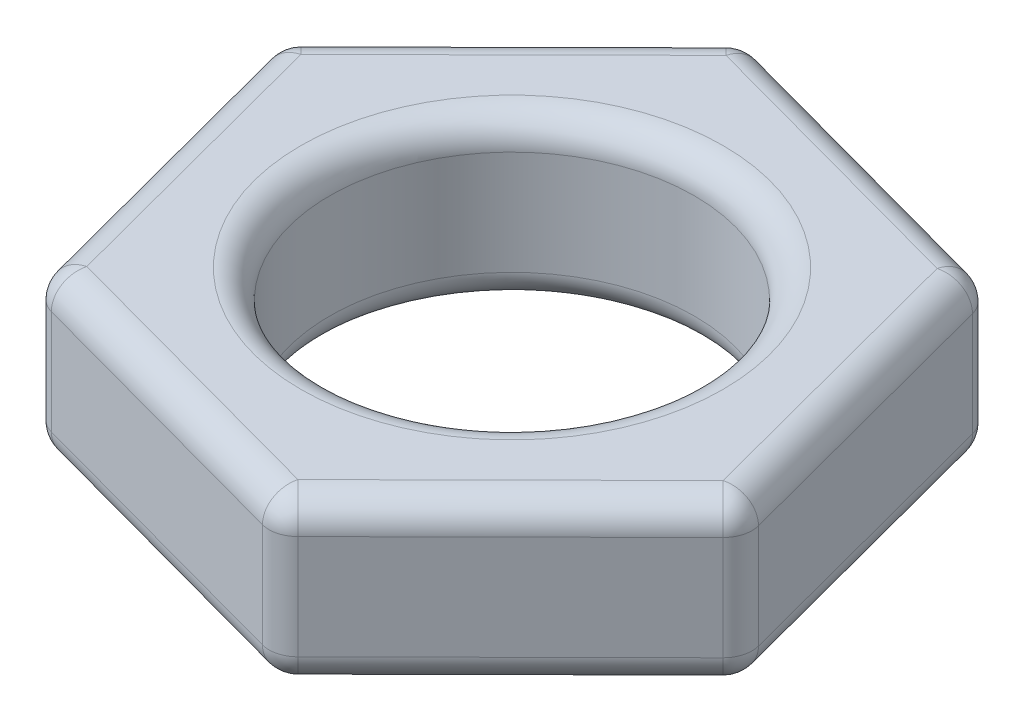
ISO-10303-21;
HEADER;
FILE_DESCRIPTION(('STEP AP214'),'2;1');
FILE_NAME('part.step','',(''),(''),'','','');
FILE_SCHEMA(('AUTOMOTIVE_DESIGN { 1 0 10303 214 1 1 1 1 }'));
ENDSEC;
DATA;
#1=APPLICATION_CONTEXT('core data for automotive mechanical design processes');
#2=APPLICATION_PROTOCOL_DEFINITION('international standard','automotive_design',2000,#1);
#3=PRODUCT_CONTEXT('',#1,'mechanical');
#4=PRODUCT('Part','Part','',(#3));
#5=PRODUCT_RELATED_PRODUCT_CATEGORY('part','',(#4));
#6=PRODUCT_DEFINITION_FORMATION('','',#4);
#7=PRODUCT_DEFINITION_CONTEXT('part definition',#1,'design');
#8=PRODUCT_DEFINITION('design','',#6,#7);
#9=PRODUCT_DEFINITION_SHAPE('','',#8);
#10=(LENGTH_UNIT() NAMED_UNIT(*) SI_UNIT(.MILLI.,.METRE.));
#11=(NAMED_UNIT(*) PLANE_ANGLE_UNIT() SI_UNIT($,.RADIAN.));
#12=(NAMED_UNIT(*) SI_UNIT($,.STERADIAN.) SOLID_ANGLE_UNIT());
#13=UNCERTAINTY_MEASURE_WITH_UNIT(LENGTH_MEASURE(1.E-05),#10,'distance_accuracy_value','');
#14=(GEOMETRIC_REPRESENTATION_CONTEXT(3) GLOBAL_UNCERTAINTY_ASSIGNED_CONTEXT((#13)) GLOBAL_UNIT_ASSIGNED_CONTEXT((#10,
#11,#12)) REPRESENTATION_CONTEXT('',''));
#15=CARTESIAN_POINT('',(0.,0.,0.));
#16=DIRECTION('',(0.,0.,1.));
#17=DIRECTION('',(1.,0.,0.));
#18=AXIS2_PLACEMENT_3D('',#15,#16,#17);
#19=CARTESIAN_POINT('',(0.,3.556,0.));
#20=DIRECTION('',(0.,1.,0.));
#21=DIRECTION('',(0.,0.,1.));
#22=AXIS2_PLACEMENT_3D('',#19,#20,#21);
#23=PLANE('',#22);
#24=DIRECTION('',(-0.964905426775641,0.,-0.262597633993375));
#25=VECTOR('',#24,1.);
#26=CARTESIAN_POINT('',(-2.03676591183855,3.556,-6.47716318720669));
#27=LINE('',#26,#25);
#28=CARTESIAN_POINT('',(4.68450572937177,3.556,-4.64797870815723));
#29=VERTEX_POINT('',#28);
#30=CARTESIAN_POINT('',(-1.68301477282748,3.556,-6.3808903198883));
#31=VERTEX_POINT('',#30);
#32=EDGE_CURVE('E202',#29,#31,#27,.T.);
#33=ORIENTED_EDGE('',*,*,#32,.T.);
#34=DIRECTION('',(-0.709868935399771,0.,0.704333794840483));
#35=VECTOR('',#34,1.);
#36=CARTESIAN_POINT('',(-6.62777082049767,3.556,-1.47469057238898));
#37=LINE('',#36,#35);
#38=CARTESIAN_POINT('',(-6.36752050219924,3.556,-1.73291161173105));
#39=VERTEX_POINT('',#38);
#40=EDGE_CURVE('E204',#31,#39,#37,.T.);
#41=ORIENTED_EDGE('',*,*,#40,.T.);
#42=DIRECTION('',(0.255036491375871,0.,0.966931428833858));
#43=VECTOR('',#42,1.);
#44=CARTESIAN_POINT('',(-4.59100490865911,3.556,5.00247261481772));
#45=LINE('',#44,#43);
#46=CARTESIAN_POINT('',(-4.68450572937175,3.556,4.64797870815725));
#47=VERTEX_POINT('',#46);
#48=EDGE_CURVE('E164',#39,#47,#45,.T.);
#49=ORIENTED_EDGE('',*,*,#48,.T.);
#50=DIRECTION('',(0.964905426775641,0.,0.262597633993374));
#51=VECTOR('',#50,1.);
#52=CARTESIAN_POINT('',(2.03676591183857,3.556,6.47716318720671));
#53=LINE('',#52,#51);
#54=CARTESIAN_POINT('',(1.6830147728275,3.556,6.38089031988832));
#55=VERTEX_POINT('',#54);
#56=EDGE_CURVE('E156',#47,#55,#53,.T.);
#57=ORIENTED_EDGE('',*,*,#56,.T.);
#58=DIRECTION('',(0.709868935399771,0.,-0.704333794840483));
#59=VECTOR('',#58,1.);
#60=CARTESIAN_POINT('',(6.62777082049768,3.556,1.47469057238901));
#61=LINE('',#60,#59);
#62=CARTESIAN_POINT('',(6.36752050219924,3.556,1.73291161173108));
#63=VERTEX_POINT('',#62);
#64=EDGE_CURVE('E161',#55,#63,#61,.T.);
#65=ORIENTED_EDGE('',*,*,#64,.T.);
#66=DIRECTION('',(-0.255036491375869,0.,-0.966931428833858));
#67=VECTOR('',#66,1.);
#68=CARTESIAN_POINT('',(4.59100490865913,3.556,-5.0024726148177));
#69=LINE('',#68,#67);
#70=EDGE_CURVE('E168',#63,#29,#69,.T.);
#71=ORIENTED_EDGE('',*,*,#70,.T.);
#72=EDGE_LOOP('',(#33,#41,#49,#57,#65,#71));
#73=FACE_BOUND('',#72,.T.);
#74=CARTESIAN_POINT('',(0.,3.556,0.));
#75=DIRECTION('',(0.,1.,0.));
#76=DIRECTION('',(0.,0.,1.));
#77=AXIS2_PLACEMENT_3D('',#74,#75,#76);
#78=CIRCLE('',#77,4.635);
#79=CARTESIAN_POINT('',(0.,3.556,4.635));
#80=VERTEX_POINT('',#79);
#81=EDGE_CURVE('E193',#80,#80,#78,.F.);
#82=ORIENTED_EDGE('',*,*,#81,.T.);
#83=EDGE_LOOP('',(#82));
#84=FACE_BOUND('',#83,.T.);
#85=ADVANCED_FACE('F33',(#73,#84),#23,.T.);
#86=CARTESIAN_POINT('',(0.,0.,0.));
#87=DIRECTION('',(0.,1.,0.));
#88=DIRECTION('',(0.,0.,1.));
#89=AXIS2_PLACEMENT_3D('',#86,#87,#88);
#90=PLANE('',#89);
#91=DIRECTION('',(0.255036491375871,0.,0.966931428833858));
#92=VECTOR('',#91,1.);
#93=CARTESIAN_POINT('',(-5.52601311578549,0.,1.4575335482131));
#94=LINE('',#93,#92);
#95=CARTESIAN_POINT('',(-4.68450572937175,0.,4.64797870815725));
#96=VERTEX_POINT('',#95);
#97=CARTESIAN_POINT('',(-6.36752050219923,0.,-1.73291161173105));
#98=VERTEX_POINT('',#97);
#99=EDGE_CURVE('E221',#96,#98,#94,.F.);
#100=ORIENTED_EDGE('',*,*,#99,.T.);
#101=DIRECTION('',(-0.709868935399771,0.,0.704333794840483));
#102=VECTOR('',#101,1.);
#103=CARTESIAN_POINT('',(-4.02526763751335,0.,-4.05690096580968));
#104=LINE('',#103,#102);
#105=CARTESIAN_POINT('',(-1.68301477282748,0.,-6.3808903198883));
#106=VERTEX_POINT('',#105);
#107=EDGE_CURVE('E226',#98,#106,#104,.F.);
#108=ORIENTED_EDGE('',*,*,#107,.T.);
#109=DIRECTION('',(-0.964905426775641,0.,-0.262597633993375));
#110=VECTOR('',#109,1.);
#111=CARTESIAN_POINT('',(1.50074547827213,0.,-5.51443451402277));
#112=LINE('',#111,#110);
#113=CARTESIAN_POINT('',(4.68450572937177,0.,-4.64797870815723));
#114=VERTEX_POINT('',#113);
#115=EDGE_CURVE('E223',#106,#114,#112,.F.);
#116=ORIENTED_EDGE('',*,*,#115,.T.);
#117=DIRECTION('',(-0.255036491375869,0.,-0.966931428833858));
#118=VECTOR('',#117,1.);
#119=CARTESIAN_POINT('',(5.5260131157855,0.,-1.45753354821309));
#120=LINE('',#119,#118);
#121=CARTESIAN_POINT('',(6.36752050219924,0.,1.73291161173108));
#122=VERTEX_POINT('',#121);
#123=EDGE_CURVE('E217',#114,#122,#120,.F.);
#124=ORIENTED_EDGE('',*,*,#123,.T.);
#125=DIRECTION('',(0.709868935399771,0.,-0.704333794840483));
#126=VECTOR('',#125,1.);
#127=CARTESIAN_POINT('',(4.02526763751337,0.,4.0569009658097));
#128=LINE('',#127,#126);
#129=CARTESIAN_POINT('',(1.6830147728275,0.,6.38089031988832));
#130=VERTEX_POINT('',#129);
#131=EDGE_CURVE('E215',#122,#130,#128,.F.);
#132=ORIENTED_EDGE('',*,*,#131,.T.);
#133=DIRECTION('',(0.964905426775641,0.,0.262597633993374));
#134=VECTOR('',#133,1.);
#135=CARTESIAN_POINT('',(-1.50074547827213,0.,5.51443451402278));
#136=LINE('',#135,#134);
#137=EDGE_CURVE('E219',#130,#96,#136,.F.);
#138=ORIENTED_EDGE('',*,*,#137,.T.);
#139=EDGE_LOOP('',(#100,#108,#116,#124,#132,#138));
#140=FACE_BOUND('',#139,.T.);
#141=CARTESIAN_POINT('',(0.,0.,0.));
#142=DIRECTION('',(0.,1.,0.));
#143=DIRECTION('',(0.,0.,1.));
#144=AXIS2_PLACEMENT_3D('',#141,#142,#143);
#145=CIRCLE('',#144,4.635);
#146=CARTESIAN_POINT('',(0.,0.,4.635));
#147=VERTEX_POINT('',#146);
#148=EDGE_CURVE('E355',#147,#147,#145,.T.);
#149=ORIENTED_EDGE('',*,*,#148,.T.);
#150=EDGE_LOOP('',(#149));
#151=FACE_BOUND('',#150,.T.);
#152=ADVANCED_FACE('F388',(#140,#151),#90,.F.);
#153=CARTESIAN_POINT('',(7.07502278022138,3.556,1.92545734636787));
#154=DIRECTION('',(-0.966931428833858,0.,0.255036491375869));
#155=DIRECTION('',(0.255036491375869,0.,0.966931428833858));
#156=AXIS2_PLACEMENT_3D('',#153,#154,#155);
#157=PLANE('',#156);
#158=DIRECTION('',(0.,-1.,0.));
#159=VECTOR('',#158,1.);
#160=CARTESIAN_POINT('',(5.29850718668127,3.556,-4.80992688018091));
#161=LINE('',#160,#159);
#162=CARTESIAN_POINT('',(5.29850718668127,0.635,-4.80992688018091));
#163=VERTEX_POINT('',#162);
#164=CARTESIAN_POINT('',(5.29850718668127,2.921,-4.80992688018091));
#165=VERTEX_POINT('',#164);
#166=EDGE_CURVE('E258',#163,#165,#161,.F.);
#167=ORIENTED_EDGE('',*,*,#166,.T.);
#168=DIRECTION('',(-0.255036491375869,0.,-0.966931428833858));
#169=VECTOR('',#168,1.);
#170=CARTESIAN_POINT('',(7.07502278022138,2.921,1.92545734636787));
#171=LINE('',#170,#169);
#172=CARTESIAN_POINT('',(6.98152195950874,2.921,1.5709634397074));
#173=VERTEX_POINT('',#172);
#174=EDGE_CURVE('E260',#165,#173,#171,.F.);
#175=ORIENTED_EDGE('',*,*,#174,.T.);
#176=DIRECTION('',(0.,-1.,0.));
#177=VECTOR('',#176,1.);
#178=CARTESIAN_POINT('',(6.98152195950874,3.556,1.5709634397074));
#179=LINE('',#178,#177);
#180=CARTESIAN_POINT('',(6.98152195950874,0.635,1.5709634397074));
#181=VERTEX_POINT('',#180);
#182=EDGE_CURVE('E254',#173,#181,#179,.T.);
#183=ORIENTED_EDGE('',*,*,#182,.T.);
#184=DIRECTION('',(-0.255036491375869,0.,-0.966931428833858));
#185=VECTOR('',#184,1.);
#186=CARTESIAN_POINT('',(7.07502278022138,0.635,1.92545734636787));
#187=LINE('',#186,#185);
#188=EDGE_CURVE('E256',#181,#163,#187,.T.);
#189=ORIENTED_EDGE('',*,*,#188,.T.);
#190=EDGE_LOOP('',(#167,#175,#183,#189));
#191=FACE_BOUND('',#190,.T.);
#192=ADVANCED_FACE('F393',(#191),#157,.F.);
#193=CARTESIAN_POINT('',(5.20500636596863,3.556,-5.16442078684137));
#194=DIRECTION('',(-0.262597633993375,0.,0.964905426775641));
#195=DIRECTION('',(0.964905426775641,0.,0.262597633993375));
#196=AXIS2_PLACEMENT_3D('',#193,#194,#195);
#197=PLANE('',#196);
#198=DIRECTION('',(-0.964905426775641,0.,-0.262597633993375));
#199=VECTOR('',#198,1.);
#200=CARTESIAN_POINT('',(5.20500636596863,0.635,-5.16442078684137));
#201=LINE('',#200,#199);
#202=CARTESIAN_POINT('',(4.85125522695756,0.635,-5.26069365415976));
#203=VERTEX_POINT('',#202);
#204=CARTESIAN_POINT('',(-1.51626527524169,0.635,-6.99360526589083));
#205=VERTEX_POINT('',#204);
#206=EDGE_CURVE('E208',#203,#205,#201,.T.);
#207=ORIENTED_EDGE('',*,*,#206,.T.);
#208=DIRECTION('',(0.,-1.,0.));
#209=VECTOR('',#208,1.);
#210=CARTESIAN_POINT('',(-1.51626527524169,3.556,-6.99360526589083));
#211=LINE('',#210,#209);
#212=CARTESIAN_POINT('',(-1.51626527524169,2.921,-6.99360526589083));
#213=VERTEX_POINT('',#212);
#214=EDGE_CURVE('E213',#205,#213,#211,.F.);
#215=ORIENTED_EDGE('',*,*,#214,.T.);
#216=DIRECTION('',(-0.964905426775641,0.,-0.262597633993375));
#217=VECTOR('',#216,1.);
#218=CARTESIAN_POINT('',(5.20500636596863,2.921,-5.16442078684137));
#219=LINE('',#218,#217);
#220=CARTESIAN_POINT('',(4.85125522695756,2.921,-5.26069365415976));
#221=VERTEX_POINT('',#220);
#222=EDGE_CURVE('E210',#213,#221,#219,.F.);
#223=ORIENTED_EDGE('',*,*,#222,.T.);
#224=DIRECTION('',(0.,-1.,0.));
#225=VECTOR('',#224,1.);
#226=CARTESIAN_POINT('',(4.85125522695756,3.556,-5.26069365415976));
#227=LINE('',#226,#225);
#228=EDGE_CURVE('E206',#221,#203,#227,.T.);
#229=ORIENTED_EDGE('',*,*,#228,.T.);
#230=EDGE_LOOP('',(#207,#215,#223,#229));
#231=FACE_BOUND('',#230,.T.);
#232=ADVANCED_FACE('F410',(#231),#197,.F.);
#233=CARTESIAN_POINT('',(-1.87001641425276,3.556,-7.08987813320922));
#234=DIRECTION('',(0.704333794840483,0.,0.709868935399771));
#235=DIRECTION('',(0.709868935399771,0.,-0.704333794840483));
#236=AXIS2_PLACEMENT_3D('',#233,#234,#235);
#237=PLANE('',#236);
#238=DIRECTION('',(-0.709868935399771,0.,0.704333794840483));
#239=VECTOR('',#238,1.);
#240=CARTESIAN_POINT('',(-1.87001641425276,2.921,-7.08987813320922));
#241=LINE('',#240,#239);
#242=CARTESIAN_POINT('',(-6.81477246192294,2.921,-2.18367838570991));
#243=VERTEX_POINT('',#242);
#244=CARTESIAN_POINT('',(-2.13026673255119,2.921,-6.83165709386715));
#245=VERTEX_POINT('',#244);
#246=EDGE_CURVE('E241',#243,#245,#241,.F.);
#247=ORIENTED_EDGE('',*,*,#246,.T.);
#248=DIRECTION('',(0.,-1.,0.));
#249=VECTOR('',#248,1.);
#250=CARTESIAN_POINT('',(-2.13026673255119,3.556,-6.83165709386715));
#251=LINE('',#250,#249);
#252=CARTESIAN_POINT('',(-2.13026673255119,0.635,-6.83165709386715));
#253=VERTEX_POINT('',#252);
#254=EDGE_CURVE('E243',#245,#253,#251,.T.);
#255=ORIENTED_EDGE('',*,*,#254,.T.);
#256=DIRECTION('',(-0.709868935399771,0.,0.704333794840483));
#257=VECTOR('',#256,1.);
#258=CARTESIAN_POINT('',(-1.87001641425276,0.635,-7.08987813320922));
#259=LINE('',#258,#257);
#260=CARTESIAN_POINT('',(-6.81477246192294,0.635,-2.18367838570991));
#261=VERTEX_POINT('',#260);
#262=EDGE_CURVE('E237',#253,#261,#259,.T.);
#263=ORIENTED_EDGE('',*,*,#262,.T.);
#264=DIRECTION('',(0.,-1.,0.));
#265=VECTOR('',#264,1.);
#266=CARTESIAN_POINT('',(-6.81477246192294,3.556,-2.18367838570991));
#267=LINE('',#266,#265);
#268=EDGE_CURVE('E239',#261,#243,#267,.F.);
#269=ORIENTED_EDGE('',*,*,#268,.T.);
#270=EDGE_LOOP('',(#247,#255,#263,#269));
#271=FACE_BOUND('',#270,.T.);
#272=ADVANCED_FACE('F406',(#271),#237,.F.);
#273=CARTESIAN_POINT('',(-7.07502278022137,3.556,-1.92545734636784));
#274=DIRECTION('',(0.966931428833858,0.,-0.255036491375871));
#275=DIRECTION('',(-0.255036491375871,0.,-0.966931428833858));
#276=AXIS2_PLACEMENT_3D('',#273,#274,#275);
#277=PLANE('',#276);
#278=DIRECTION('',(0.255036491375871,0.,0.966931428833858));
#279=VECTOR('',#278,1.);
#280=CARTESIAN_POINT('',(-7.07502278022137,2.921,-1.92545734636784));
#281=LINE('',#280,#279);
#282=CARTESIAN_POINT('',(-5.29850718668125,2.921,4.80992688018093));
#283=VERTEX_POINT('',#282);
#284=CARTESIAN_POINT('',(-6.98152195950873,2.921,-1.57096343970737));
#285=VERTEX_POINT('',#284);
#286=EDGE_CURVE('E232',#283,#285,#281,.F.);
#287=ORIENTED_EDGE('',*,*,#286,.T.);
#288=DIRECTION('',(0.,-1.,0.));
#289=VECTOR('',#288,1.);
#290=CARTESIAN_POINT('',(-6.98152195950873,3.556,-1.57096343970737));
#291=LINE('',#290,#289);
#292=CARTESIAN_POINT('',(-6.98152195950873,0.635,-1.57096343970737));
#293=VERTEX_POINT('',#292);
#294=EDGE_CURVE('E235',#285,#293,#291,.T.);
#295=ORIENTED_EDGE('',*,*,#294,.T.);
#296=DIRECTION('',(0.255036491375871,0.,0.966931428833858));
#297=VECTOR('',#296,1.);
#298=CARTESIAN_POINT('',(-7.07502278022137,0.635,-1.92545734636784));
#299=LINE('',#298,#297);
#300=CARTESIAN_POINT('',(-5.29850718668125,0.635,4.80992688018093));
#301=VERTEX_POINT('',#300);
#302=EDGE_CURVE('E230',#293,#301,#299,.T.);
#303=ORIENTED_EDGE('',*,*,#302,.T.);
#304=DIRECTION('',(0.,-1.,0.));
#305=VECTOR('',#304,1.);
#306=CARTESIAN_POINT('',(-5.29850718668125,3.556,4.80992688018093));
#307=LINE('',#306,#305);
#308=EDGE_CURVE('E228',#301,#283,#307,.F.);
#309=ORIENTED_EDGE('',*,*,#308,.T.);
#310=EDGE_LOOP('',(#287,#295,#303,#309));
#311=FACE_BOUND('',#310,.T.);
#312=ADVANCED_FACE('F402',(#311),#277,.F.);
#313=CARTESIAN_POINT('',(-5.20500636596861,3.556,5.16442078684139));
#314=DIRECTION('',(0.262597633993374,0.,-0.964905426775641));
#315=DIRECTION('',(-0.964905426775641,0.,-0.262597633993374));
#316=AXIS2_PLACEMENT_3D('',#313,#314,#315);
#317=PLANE('',#316);
#318=DIRECTION('',(0.964905426775641,0.,0.262597633993374));
#319=VECTOR('',#318,1.);
#320=CARTESIAN_POINT('',(-5.20500636596861,2.921,5.16442078684139));
#321=LINE('',#320,#319);
#322=CARTESIAN_POINT('',(1.51626527524171,2.921,6.99360526589085));
#323=VERTEX_POINT('',#322);
#324=CARTESIAN_POINT('',(-4.85125522695754,2.921,5.26069365415979));
#325=VERTEX_POINT('',#324);
#326=EDGE_CURVE('E175',#323,#325,#321,.F.);
#327=ORIENTED_EDGE('',*,*,#326,.T.);
#328=DIRECTION('',(0.,-1.,0.));
#329=VECTOR('',#328,1.);
#330=CARTESIAN_POINT('',(-4.85125522695754,3.556,5.26069365415979));
#331=LINE('',#330,#329);
#332=CARTESIAN_POINT('',(-4.85125522695754,0.635,5.26069365415979));
#333=VERTEX_POINT('',#332);
#334=EDGE_CURVE('E251',#325,#333,#331,.T.);
#335=ORIENTED_EDGE('',*,*,#334,.T.);
#336=DIRECTION('',(0.964905426775641,0.,0.262597633993374));
#337=VECTOR('',#336,1.);
#338=CARTESIAN_POINT('',(-5.20500636596861,0.635,5.16442078684139));
#339=LINE('',#338,#337);
#340=CARTESIAN_POINT('',(1.51626527524171,0.635,6.99360526589085));
#341=VERTEX_POINT('',#340);
#342=EDGE_CURVE('E248',#333,#341,#339,.T.);
#343=ORIENTED_EDGE('',*,*,#342,.T.);
#344=DIRECTION('',(0.,-1.,0.));
#345=VECTOR('',#344,1.);
#346=CARTESIAN_POINT('',(1.51626527524171,3.556,6.99360526589085));
#347=LINE('',#346,#345);
#348=EDGE_CURVE('E246',#341,#323,#347,.F.);
#349=ORIENTED_EDGE('',*,*,#348,.T.);
#350=EDGE_LOOP('',(#327,#335,#343,#349));
#351=FACE_BOUND('',#350,.T.);
#352=ADVANCED_FACE('F399',(#351),#317,.F.);
#353=CARTESIAN_POINT('',(1.87001641425278,3.556,7.08987813320924));
#354=DIRECTION('',(-0.704333794840483,0.,-0.709868935399771));
#355=DIRECTION('',(-0.709868935399771,0.,0.704333794840483));
#356=AXIS2_PLACEMENT_3D('',#353,#354,#355);
#357=PLANE('',#356);
#358=DIRECTION('',(0.709868935399771,0.,-0.704333794840483));
#359=VECTOR('',#358,1.);
#360=CARTESIAN_POINT('',(1.87001641425278,2.921,7.08987813320924));
#361=LINE('',#360,#359);
#362=CARTESIAN_POINT('',(6.81477246192295,2.921,2.18367838570994));
#363=VERTEX_POINT('',#362);
#364=CARTESIAN_POINT('',(2.13026673255121,2.921,6.83165709386717));
#365=VERTEX_POINT('',#364);
#366=EDGE_CURVE('E42',#363,#365,#361,.F.);
#367=ORIENTED_EDGE('',*,*,#366,.T.);
#368=DIRECTION('',(0.,-1.,0.));
#369=VECTOR('',#368,1.);
#370=CARTESIAN_POINT('',(2.13026673255121,3.556,6.83165709386717));
#371=LINE('',#370,#369);
#372=CARTESIAN_POINT('',(2.13026673255121,0.635,6.83165709386717));
#373=VERTEX_POINT('',#372);
#374=EDGE_CURVE('E11',#365,#373,#371,.T.);
#375=ORIENTED_EDGE('',*,*,#374,.T.);
#376=DIRECTION('',(0.709868935399771,0.,-0.704333794840483));
#377=VECTOR('',#376,1.);
#378=CARTESIAN_POINT('',(1.87001641425278,0.635,7.08987813320924));
#379=LINE('',#378,#377);
#380=CARTESIAN_POINT('',(6.81477246192295,0.635,2.18367838570994));
#381=VERTEX_POINT('',#380);
#382=EDGE_CURVE('E263',#373,#381,#379,.T.);
#383=ORIENTED_EDGE('',*,*,#382,.T.);
#384=DIRECTION('',(0.,-1.,0.));
#385=VECTOR('',#384,1.);
#386=CARTESIAN_POINT('',(6.81477246192295,3.556,2.18367838570994));
#387=LINE('',#386,#385);
#388=EDGE_CURVE('E53',#381,#363,#387,.F.);
#389=ORIENTED_EDGE('',*,*,#388,.T.);
#390=EDGE_LOOP('',(#367,#375,#383,#389));
#391=FACE_BOUND('',#390,.T.);
#392=ADVANCED_FACE('F384',(#391),#357,.F.);
#393=CARTESIAN_POINT('',(0.,3.556,0.));
#394=DIRECTION('',(0.,-1.,0.));
#395=DIRECTION('',(0.,0.,-1.));
#396=AXIS2_PLACEMENT_3D('',#393,#394,#395);
#397=CYLINDRICAL_SURFACE('',#396,4.);
#398=CARTESIAN_POINT('',(0.,0.635,0.));
#399=DIRECTION('',(0.,1.,0.));
#400=DIRECTION('',(0.,0.,1.));
#401=AXIS2_PLACEMENT_3D('',#398,#399,#400);
#402=CIRCLE('',#401,4.);
#403=CARTESIAN_POINT('',(0.,0.635,4.));
#404=VERTEX_POINT('',#403);
#405=EDGE_CURVE('E197',#404,#404,#402,.F.);
#406=ORIENTED_EDGE('',*,*,#405,.T.);
#407=EDGE_LOOP('',(#406));
#408=FACE_BOUND('',#407,.T.);
#409=CARTESIAN_POINT('',(0.,2.921,0.));
#410=DIRECTION('',(0.,1.,0.));
#411=DIRECTION('',(0.,0.,1.));
#412=AXIS2_PLACEMENT_3D('',#409,#410,#411);
#413=CIRCLE('',#412,4.);
#414=CARTESIAN_POINT('',(0.,2.921,4.));
#415=VERTEX_POINT('',#414);
#416=EDGE_CURVE('E361',#415,#415,#413,.T.);
#417=ORIENTED_EDGE('',*,*,#416,.T.);
#418=EDGE_LOOP('',(#417));
#419=FACE_BOUND('',#418,.T.);
#420=ADVANCED_FACE('F370',(#408,#419),#397,.F.);
#421=CARTESIAN_POINT('',(0.,0.635,0.));
#422=DIRECTION('',(0.,1.,0.));
#423=DIRECTION('',(0.,0.,1.));
#424=AXIS2_PLACEMENT_3D('',#421,#422,#423);
#425=TOROIDAL_SURFACE('',#424,4.635,0.635);
#426=ORIENTED_EDGE('',*,*,#405,.F.);
#427=EDGE_LOOP('',(#426));
#428=FACE_BOUND('',#427,.T.);
#429=ORIENTED_EDGE('',*,*,#148,.F.);
#430=EDGE_LOOP('',(#429));
#431=FACE_BOUND('',#430,.T.);
#432=ADVANCED_FACE('F373',(#428,#431),#425,.T.);
#433=CARTESIAN_POINT('',(0.,2.921,0.));
#434=DIRECTION('',(0.,1.,0.));
#435=DIRECTION('',(0.,0.,1.));
#436=AXIS2_PLACEMENT_3D('',#433,#434,#435);
#437=TOROIDAL_SURFACE('',#436,4.635,0.635);
#438=ORIENTED_EDGE('',*,*,#81,.F.);
#439=EDGE_LOOP('',(#438));
#440=FACE_BOUND('',#439,.T.);
#441=ORIENTED_EDGE('',*,*,#416,.F.);
#442=EDGE_LOOP('',(#441));
#443=FACE_BOUND('',#442,.T.);
#444=ADVANCED_FACE('F376',(#440,#443),#437,.T.);
#445=CARTESIAN_POINT('',(-5.03825686838282,0.635,4.55170584083886));
#446=DIRECTION('',(0.964905426775641,0.,0.262597633993374));
#447=DIRECTION('',(0.262597633993374,0.,-0.964905426775641));
#448=AXIS2_PLACEMENT_3D('',#445,#446,#447);
#449=CYLINDRICAL_SURFACE('',#448,0.635);
#450=CARTESIAN_POINT('',(1.6830147728275,0.635,6.38089031988832));
#451=DIRECTION('',(0.964905426775641,0.,0.262597633993374));
#452=DIRECTION('',(0.262597633993375,0.,-0.964905426775641));
#453=AXIS2_PLACEMENT_3D('',#450,#451,#452);
#454=CIRCLE('',#453,0.635);
#455=EDGE_CURVE('E37',#341,#130,#454,.T.);
#456=ORIENTED_EDGE('',*,*,#455,.F.);
#457=ORIENTED_EDGE('',*,*,#342,.F.);
#458=CARTESIAN_POINT('',(-4.68450572937175,0.635,4.64797870815725));
#459=DIRECTION('',(-0.964905426775641,0.,-0.262597633993374));
#460=DIRECTION('',(-0.262597633993375,0.,0.964905426775641));
#461=AXIS2_PLACEMENT_3D('',#458,#459,#460);
#462=CIRCLE('',#461,0.635);
#463=EDGE_CURVE('E347',#96,#333,#462,.T.);
#464=ORIENTED_EDGE('',*,*,#463,.F.);
#465=ORIENTED_EDGE('',*,*,#137,.F.);
#466=EDGE_LOOP('',(#456,#457,#464,#465));
#467=FACE_BOUND('',#466,.T.);
#468=ADVANCED_FACE('F35',(#467),#449,.T.);
#469=CARTESIAN_POINT('',(1.6830147728275,0.635,6.38089031988832));
#470=DIRECTION('',(0.,0.,1.));
#471=DIRECTION('',(1.,0.,0.));
#472=AXIS2_PLACEMENT_3D('',#469,#470,#471);
#473=SPHERICAL_SURFACE('',#472,0.635);
#474=CARTESIAN_POINT('',(1.6830147728275,0.635,6.38089031988832));
#475=DIRECTION('',(0.,-1.,0.));
#476=DIRECTION('',(0.,0.,-1.));
#477=AXIS2_PLACEMENT_3D('',#474,#475,#476);
#478=CIRCLE('',#477,0.635);
#479=EDGE_CURVE('E342',#341,#373,#478,.F.);
#480=ORIENTED_EDGE('',*,*,#479,.F.);
#481=ORIENTED_EDGE('',*,*,#455,.T.);
#482=CARTESIAN_POINT('',(1.6830147728275,0.635,6.38089031988832));
#483=DIRECTION('',(-0.709868935399771,0.,0.704333794840483));
#484=DIRECTION('',(0.704333794840483,0.,0.709868935399771));
#485=AXIS2_PLACEMENT_3D('',#482,#483,#484);
#486=CIRCLE('',#485,0.635);
#487=EDGE_CURVE('E345',#373,#130,#486,.F.);
#488=ORIENTED_EDGE('',*,*,#487,.F.);
#489=EDGE_LOOP('',(#480,#481,#488));
#490=FACE_BOUND('',#489,.T.);
#491=ADVANCED_FACE('F516',(#490),#473,.T.);
#492=CARTESIAN_POINT('',(-4.68450572937175,0.635,4.64797870815725));
#493=DIRECTION('',(0.,0.,1.));
#494=DIRECTION('',(1.,0.,0.));
#495=AXIS2_PLACEMENT_3D('',#492,#493,#494);
#496=SPHERICAL_SURFACE('',#495,0.635);
#497=CARTESIAN_POINT('',(-4.68450572937175,0.635,4.64797870815725));
#498=DIRECTION('',(0.255036491375872,0.,0.966931428833857));
#499=DIRECTION('',(0.966931428833858,0.,-0.255036491375872));
#500=AXIS2_PLACEMENT_3D('',#497,#498,#499);
#501=CIRCLE('',#500,0.635);
#502=EDGE_CURVE('E337',#96,#301,#501,.F.);
#503=ORIENTED_EDGE('',*,*,#502,.F.);
#504=ORIENTED_EDGE('',*,*,#463,.T.);
#505=CARTESIAN_POINT('',(-4.68450572937175,0.635,4.64797870815725));
#506=DIRECTION('',(0.,-1.,0.));
#507=DIRECTION('',(0.,0.,-1.));
#508=AXIS2_PLACEMENT_3D('',#505,#506,#507);
#509=CIRCLE('',#508,0.635);
#510=EDGE_CURVE('E340',#301,#333,#509,.F.);
#511=ORIENTED_EDGE('',*,*,#510,.F.);
#512=EDGE_LOOP('',(#503,#504,#511));
#513=FACE_BOUND('',#512,.T.);
#514=ADVANCED_FACE('F513',(#513),#496,.T.);
#515=CARTESIAN_POINT('',(1.42276445452907,0.635,6.63911135923039));
#516=DIRECTION('',(0.709868935399771,0.,-0.704333794840483));
#517=DIRECTION('',(-0.704333794840483,0.,-0.709868935399771));
#518=AXIS2_PLACEMENT_3D('',#515,#516,#517);
#519=CYLINDRICAL_SURFACE('',#518,0.635);
#520=ORIENTED_EDGE('',*,*,#487,.T.);
#521=ORIENTED_EDGE('',*,*,#131,.F.);
#522=CARTESIAN_POINT('',(6.36752050219924,0.635,1.73291161173108));
#523=DIRECTION('',(0.709868935399771,0.,-0.704333794840483));
#524=DIRECTION('',(-0.704333794840483,0.,-0.709868935399771));
#525=AXIS2_PLACEMENT_3D('',#522,#523,#524);
#526=CIRCLE('',#525,0.635);
#527=EDGE_CURVE('E334',#381,#122,#526,.T.);
#528=ORIENTED_EDGE('',*,*,#527,.F.);
#529=ORIENTED_EDGE('',*,*,#382,.F.);
#530=EDGE_LOOP('',(#520,#521,#528,#529));
#531=FACE_BOUND('',#530,.T.);
#532=ADVANCED_FACE('F509',(#531),#519,.T.);
#533=CARTESIAN_POINT('',(1.6830147728275,3.556,6.38089031988832));
#534=DIRECTION('',(0.,-1.,0.));
#535=DIRECTION('',(0.,0.,-1.));
#536=AXIS2_PLACEMENT_3D('',#533,#534,#535);
#537=CYLINDRICAL_SURFACE('',#536,0.635);
#538=ORIENTED_EDGE('',*,*,#479,.T.);
#539=ORIENTED_EDGE('',*,*,#374,.F.);
#540=CARTESIAN_POINT('',(1.6830147728275,2.921,6.38089031988832));
#541=DIRECTION('',(0.,1.,0.));
#542=DIRECTION('',(0.,0.,1.));
#543=AXIS2_PLACEMENT_3D('',#540,#541,#542);
#544=CIRCLE('',#543,0.635);
#545=EDGE_CURVE('E179',#323,#365,#544,.T.);
#546=ORIENTED_EDGE('',*,*,#545,.F.);
#547=ORIENTED_EDGE('',*,*,#348,.F.);
#548=EDGE_LOOP('',(#538,#539,#546,#547));
#549=FACE_BOUND('',#548,.T.);
#550=ADVANCED_FACE('F506',(#549),#537,.T.);
#551=CARTESIAN_POINT('',(-1.50074547827213,2.921,5.51443451402278));
#552=DIRECTION('',(-0.964905426775641,0.,-0.262597633993374));
#553=DIRECTION('',(-0.262597633993374,0.,0.964905426775641));
#554=AXIS2_PLACEMENT_3D('',#551,#552,#553);
#555=CYLINDRICAL_SURFACE('',#554,0.635);
#556=CARTESIAN_POINT('',(-4.68450572937175,2.921,4.64797870815725));
#557=DIRECTION('',(-0.964905426775641,0.,-0.262597633993374));
#558=DIRECTION('',(-0.262597633993375,0.,0.964905426775641));
#559=AXIS2_PLACEMENT_3D('',#556,#557,#558);
#560=CIRCLE('',#559,0.635);
#561=EDGE_CURVE('E180',#325,#47,#560,.T.);
#562=ORIENTED_EDGE('',*,*,#561,.F.);
#563=ORIENTED_EDGE('',*,*,#326,.F.);
#564=CARTESIAN_POINT('',(1.6830147728275,2.921,6.38089031988832));
#565=DIRECTION('',(0.964905426775641,0.,0.262597633993375));
#566=DIRECTION('',(0.262597633993375,0.,-0.964905426775641));
#567=AXIS2_PLACEMENT_3D('',#564,#565,#566);
#568=CIRCLE('',#567,0.635);
#569=EDGE_CURVE('E172',#55,#323,#568,.T.);
#570=ORIENTED_EDGE('',*,*,#569,.F.);
#571=ORIENTED_EDGE('',*,*,#56,.F.);
#572=EDGE_LOOP('',(#562,#563,#570,#571));
#573=FACE_BOUND('',#572,.T.);
#574=ADVANCED_FACE('F174',(#573),#555,.T.);
#575=CARTESIAN_POINT('',(-4.68450572937175,3.556,4.64797870815725));
#576=DIRECTION('',(0.,-1.,0.));
#577=DIRECTION('',(0.,0.,-1.));
#578=AXIS2_PLACEMENT_3D('',#575,#576,#577);
#579=CYLINDRICAL_SURFACE('',#578,0.635);
#580=ORIENTED_EDGE('',*,*,#510,.T.);
#581=ORIENTED_EDGE('',*,*,#334,.F.);
#582=CARTESIAN_POINT('',(-4.68450572937175,2.921,4.64797870815725));
#583=DIRECTION('',(0.,1.,0.));
#584=DIRECTION('',(0.,0.,1.));
#585=AXIS2_PLACEMENT_3D('',#582,#583,#584);
#586=CIRCLE('',#585,0.635);
#587=EDGE_CURVE('E329',#283,#325,#586,.T.);
#588=ORIENTED_EDGE('',*,*,#587,.F.);
#589=ORIENTED_EDGE('',*,*,#308,.F.);
#590=EDGE_LOOP('',(#580,#581,#588,#589));
#591=FACE_BOUND('',#590,.T.);
#592=ADVANCED_FACE('F480',(#591),#579,.T.);
#593=CARTESIAN_POINT('',(-6.46102132291187,0.635,-2.08740551839151));
#594=DIRECTION('',(0.255036491375871,0.,0.966931428833858));
#595=DIRECTION('',(0.966931428833858,0.,-0.255036491375871));
#596=AXIS2_PLACEMENT_3D('',#593,#594,#595);
#597=CYLINDRICAL_SURFACE('',#596,0.635);
#598=ORIENTED_EDGE('',*,*,#502,.T.);
#599=ORIENTED_EDGE('',*,*,#302,.F.);
#600=CARTESIAN_POINT('',(-6.36752050219923,0.635,-1.73291161173105));
#601=DIRECTION('',(-0.255036491375871,0.,-0.966931428833858));
#602=DIRECTION('',(-0.966931428833858,0.,0.255036491375871));
#603=AXIS2_PLACEMENT_3D('',#600,#601,#602);
#604=CIRCLE('',#603,0.635);
#605=EDGE_CURVE('E326',#98,#293,#604,.T.);
#606=ORIENTED_EDGE('',*,*,#605,.F.);
#607=ORIENTED_EDGE('',*,*,#99,.F.);
#608=EDGE_LOOP('',(#598,#599,#606,#607));
#609=FACE_BOUND('',#608,.T.);
#610=ADVANCED_FACE('F497',(#609),#597,.T.);
#611=CARTESIAN_POINT('',(6.36752050219924,0.635,1.73291161173108));
#612=DIRECTION('',(0.,0.,1.));
#613=DIRECTION('',(1.,0.,0.));
#614=AXIS2_PLACEMENT_3D('',#611,#612,#613);
#615=SPHERICAL_SURFACE('',#614,0.635);
#616=CARTESIAN_POINT('',(6.36752050219924,0.635,1.73291161173108));
#617=DIRECTION('',(0.,-1.,0.));
#618=DIRECTION('',(0.,0.,-1.));
#619=AXIS2_PLACEMENT_3D('',#616,#617,#618);
#620=CIRCLE('',#619,0.635);
#621=EDGE_CURVE('E186',#381,#181,#620,.F.);
#622=ORIENTED_EDGE('',*,*,#621,.F.);
#623=ORIENTED_EDGE('',*,*,#527,.T.);
#624=CARTESIAN_POINT('',(6.36752050219924,0.635,1.73291161173108));
#625=DIRECTION('',(0.255036491375869,0.,0.966931428833858));
#626=DIRECTION('',(0.966931428833858,0.,-0.255036491375869));
#627=AXIS2_PLACEMENT_3D('',#624,#625,#626);
#628=CIRCLE('',#627,0.635);
#629=EDGE_CURVE('E323',#181,#122,#628,.F.);
#630=ORIENTED_EDGE('',*,*,#629,.F.);
#631=EDGE_LOOP('',(#622,#623,#630));
#632=FACE_BOUND('',#631,.T.);
#633=ADVANCED_FACE('F491',(#632),#615,.T.);
#634=CARTESIAN_POINT('',(1.6830147728275,2.921,6.38089031988832));
#635=DIRECTION('',(0.,0.,1.));
#636=DIRECTION('',(1.,0.,0.));
#637=AXIS2_PLACEMENT_3D('',#634,#635,#636);
#638=SPHERICAL_SURFACE('',#637,0.635);
#639=ORIENTED_EDGE('',*,*,#569,.T.);
#640=ORIENTED_EDGE('',*,*,#545,.T.);
#641=CARTESIAN_POINT('',(1.6830147728275,2.921,6.38089031988832));
#642=DIRECTION('',(-0.709868935399771,0.,0.704333794840483));
#643=DIRECTION('',(0.704333794840483,0.,0.709868935399771));
#644=AXIS2_PLACEMENT_3D('',#641,#642,#643);
#645=CIRCLE('',#644,0.635);
#646=EDGE_CURVE('E183',#55,#365,#645,.F.);
#647=ORIENTED_EDGE('',*,*,#646,.F.);
#648=EDGE_LOOP('',(#639,#640,#647));
#649=FACE_BOUND('',#648,.T.);
#650=ADVANCED_FACE('F184',(#649),#638,.T.);
#651=CARTESIAN_POINT('',(-4.68450572937175,2.921,4.64797870815725));
#652=DIRECTION('',(0.,0.,1.));
#653=DIRECTION('',(1.,0.,0.));
#654=AXIS2_PLACEMENT_3D('',#651,#652,#653);
#655=SPHERICAL_SURFACE('',#654,0.635);
#656=ORIENTED_EDGE('',*,*,#587,.T.);
#657=ORIENTED_EDGE('',*,*,#561,.T.);
#658=CARTESIAN_POINT('',(-4.68450572937175,2.921,4.64797870815725));
#659=DIRECTION('',(0.255036491375871,0.,0.966931428833858));
#660=DIRECTION('',(0.966931428833858,0.,-0.255036491375871));
#661=AXIS2_PLACEMENT_3D('',#658,#659,#660);
#662=CIRCLE('',#661,0.635);
#663=EDGE_CURVE('E187',#283,#47,#662,.F.);
#664=ORIENTED_EDGE('',*,*,#663,.F.);
#665=EDGE_LOOP('',(#656,#657,#664));
#666=FACE_BOUND('',#665,.T.);
#667=ADVANCED_FACE('F482',(#666),#655,.T.);
#668=CARTESIAN_POINT('',(-6.36752050219924,0.635,-1.73291161173105));
#669=DIRECTION('',(0.,0.,1.));
#670=DIRECTION('',(1.,0.,0.));
#671=AXIS2_PLACEMENT_3D('',#668,#669,#670);
#672=SPHERICAL_SURFACE('',#671,0.635);
#673=CARTESIAN_POINT('',(-6.36752050219923,0.635,-1.73291161173105));
#674=DIRECTION('',(-0.709868935399771,0.,0.704333794840483));
#675=DIRECTION('',(0.704333794840483,0.,0.709868935399771));
#676=AXIS2_PLACEMENT_3D('',#673,#674,#675);
#677=CIRCLE('',#676,0.635);
#678=EDGE_CURVE('E313',#98,#261,#677,.F.);
#679=ORIENTED_EDGE('',*,*,#678,.F.);
#680=ORIENTED_EDGE('',*,*,#605,.T.);
#681=CARTESIAN_POINT('',(-6.36752050219923,0.635,-1.73291161173105));
#682=DIRECTION('',(0.,-1.,0.));
#683=DIRECTION('',(0.,0.,-1.));
#684=AXIS2_PLACEMENT_3D('',#681,#682,#683);
#685=CIRCLE('',#684,0.635);
#686=EDGE_CURVE('E316',#261,#293,#685,.F.);
#687=ORIENTED_EDGE('',*,*,#686,.F.);
#688=EDGE_LOOP('',(#679,#680,#687));
#689=FACE_BOUND('',#688,.T.);
#690=ADVANCED_FACE('F471',(#689),#672,.T.);
#691=CARTESIAN_POINT('',(6.46102132291188,0.635,2.08740551839154));
#692=DIRECTION('',(-0.255036491375869,0.,-0.966931428833858));
#693=DIRECTION('',(-0.966931428833858,0.,0.255036491375869));
#694=AXIS2_PLACEMENT_3D('',#691,#692,#693);
#695=CYLINDRICAL_SURFACE('',#694,0.635);
#696=ORIENTED_EDGE('',*,*,#629,.T.);
#697=ORIENTED_EDGE('',*,*,#123,.F.);
#698=CARTESIAN_POINT('',(4.68450572937177,0.635,-4.64797870815723));
#699=DIRECTION('',(-0.255036491375869,0.,-0.966931428833858));
#700=DIRECTION('',(-0.966931428833858,0.,0.255036491375869));
#701=AXIS2_PLACEMENT_3D('',#698,#699,#700);
#702=CIRCLE('',#701,0.635);
#703=EDGE_CURVE('E308',#163,#114,#702,.T.);
#704=ORIENTED_EDGE('',*,*,#703,.F.);
#705=ORIENTED_EDGE('',*,*,#188,.F.);
#706=EDGE_LOOP('',(#696,#697,#704,#705));
#707=FACE_BOUND('',#706,.T.);
#708=ADVANCED_FACE('F489',(#707),#695,.T.);
#709=CARTESIAN_POINT('',(6.36752050219924,3.556,1.73291161173108));
#710=DIRECTION('',(0.,-1.,0.));
#711=DIRECTION('',(0.,0.,-1.));
#712=AXIS2_PLACEMENT_3D('',#709,#710,#711);
#713=CYLINDRICAL_SURFACE('',#712,0.635);
#714=ORIENTED_EDGE('',*,*,#621,.T.);
#715=ORIENTED_EDGE('',*,*,#182,.F.);
#716=CARTESIAN_POINT('',(6.36752050219924,2.921,1.73291161173108));
#717=DIRECTION('',(0.,1.,0.));
#718=DIRECTION('',(0.,0.,1.));
#719=AXIS2_PLACEMENT_3D('',#716,#717,#718);
#720=CIRCLE('',#719,0.635);
#721=EDGE_CURVE('E305',#363,#173,#720,.T.);
#722=ORIENTED_EDGE('',*,*,#721,.F.);
#723=ORIENTED_EDGE('',*,*,#388,.F.);
#724=EDGE_LOOP('',(#714,#715,#722,#723));
#725=FACE_BOUND('',#724,.T.);
#726=ADVANCED_FACE('F578',(#725),#713,.T.);
#727=CARTESIAN_POINT('',(4.02526763751337,2.921,4.0569009658097));
#728=DIRECTION('',(-0.709868935399771,0.,0.704333794840483));
#729=DIRECTION('',(0.704333794840483,0.,0.709868935399771));
#730=AXIS2_PLACEMENT_3D('',#727,#728,#729);
#731=CYLINDRICAL_SURFACE('',#730,0.635);
#732=ORIENTED_EDGE('',*,*,#646,.T.);
#733=ORIENTED_EDGE('',*,*,#366,.F.);
#734=CARTESIAN_POINT('',(6.36752050219924,2.921,1.73291161173108));
#735=DIRECTION('',(0.709868935399772,0.,-0.704333794840482));
#736=DIRECTION('',(-0.704333794840482,0.,-0.709868935399772));
#737=AXIS2_PLACEMENT_3D('',#734,#735,#736);
#738=CIRCLE('',#737,0.635);
#739=EDGE_CURVE('E191',#63,#363,#738,.T.);
#740=ORIENTED_EDGE('',*,*,#739,.F.);
#741=ORIENTED_EDGE('',*,*,#64,.F.);
#742=EDGE_LOOP('',(#732,#733,#740,#741));
#743=FACE_BOUND('',#742,.T.);
#744=ADVANCED_FACE('F189',(#743),#731,.T.);
#745=CARTESIAN_POINT('',(-5.52601311578549,2.921,1.4575335482131));
#746=DIRECTION('',(-0.255036491375871,0.,-0.966931428833858));
#747=DIRECTION('',(-0.966931428833858,0.,0.255036491375871));
#748=AXIS2_PLACEMENT_3D('',#745,#746,#747);
#749=CYLINDRICAL_SURFACE('',#748,0.635);
#750=ORIENTED_EDGE('',*,*,#663,.T.);
#751=ORIENTED_EDGE('',*,*,#48,.F.);
#752=CARTESIAN_POINT('',(-6.36752050219923,2.921,-1.73291161173105));
#753=DIRECTION('',(-0.255036491375871,0.,-0.966931428833857));
#754=DIRECTION('',(-0.966931428833858,0.,0.255036491375871));
#755=AXIS2_PLACEMENT_3D('',#752,#753,#754);
#756=CIRCLE('',#755,0.635);
#757=EDGE_CURVE('E301',#285,#39,#756,.T.);
#758=ORIENTED_EDGE('',*,*,#757,.F.);
#759=ORIENTED_EDGE('',*,*,#286,.F.);
#760=EDGE_LOOP('',(#750,#751,#758,#759));
#761=FACE_BOUND('',#760,.T.);
#762=ADVANCED_FACE('F443',(#761),#749,.T.);
#763=CARTESIAN_POINT('',(-6.36752050219923,3.556,-1.73291161173105));
#764=DIRECTION('',(0.,-1.,0.));
#765=DIRECTION('',(0.,0.,-1.));
#766=AXIS2_PLACEMENT_3D('',#763,#764,#765);
#767=CYLINDRICAL_SURFACE('',#766,0.635);
#768=ORIENTED_EDGE('',*,*,#686,.T.);
#769=ORIENTED_EDGE('',*,*,#294,.F.);
#770=CARTESIAN_POINT('',(-6.36752050219923,2.921,-1.73291161173105));
#771=DIRECTION('',(0.,1.,0.));
#772=DIRECTION('',(0.,0.,1.));
#773=AXIS2_PLACEMENT_3D('',#770,#771,#772);
#774=CIRCLE('',#773,0.635);
#775=EDGE_CURVE('E299',#243,#285,#774,.T.);
#776=ORIENTED_EDGE('',*,*,#775,.F.);
#777=ORIENTED_EDGE('',*,*,#268,.F.);
#778=EDGE_LOOP('',(#768,#769,#776,#777));
#779=FACE_BOUND('',#778,.T.);
#780=ADVANCED_FACE('F474',(#779),#767,.T.);
#781=CARTESIAN_POINT('',(-1.42276445452905,0.635,-6.63911135923037));
#782=DIRECTION('',(-0.709868935399771,0.,0.704333794840483));
#783=DIRECTION('',(0.704333794840483,0.,0.709868935399771));
#784=AXIS2_PLACEMENT_3D('',#781,#782,#783);
#785=CYLINDRICAL_SURFACE('',#784,0.635);
#786=ORIENTED_EDGE('',*,*,#678,.T.);
#787=ORIENTED_EDGE('',*,*,#262,.F.);
#788=CARTESIAN_POINT('',(-1.68301477282748,0.635,-6.3808903198883));
#789=DIRECTION('',(0.709868935399771,0.,-0.704333794840483));
#790=DIRECTION('',(-0.704333794840484,0.,-0.709868935399771));
#791=AXIS2_PLACEMENT_3D('',#788,#789,#790);
#792=CIRCLE('',#791,0.635);
#793=EDGE_CURVE('E296',#106,#253,#792,.T.);
#794=ORIENTED_EDGE('',*,*,#793,.F.);
#795=ORIENTED_EDGE('',*,*,#107,.F.);
#796=EDGE_LOOP('',(#786,#787,#794,#795));
#797=FACE_BOUND('',#796,.T.);
#798=ADVANCED_FACE('F467',(#797),#785,.T.);
#799=CARTESIAN_POINT('',(5.03825686838284,0.635,-4.55170584083884));
#800=DIRECTION('',(-0.964905426775641,0.,-0.262597633993375));
#801=DIRECTION('',(-0.262597633993375,0.,0.964905426775641));
#802=AXIS2_PLACEMENT_3D('',#799,#800,#801);
#803=CYLINDRICAL_SURFACE('',#802,0.635);
#804=CARTESIAN_POINT('',(4.68450572937177,0.635,-4.64797870815723));
#805=DIRECTION('',(0.964905426775641,0.,0.262597633993374));
#806=DIRECTION('',(0.262597633993375,0.,-0.964905426775641));
#807=AXIS2_PLACEMENT_3D('',#804,#805,#806);
#808=CIRCLE('',#807,0.635);
#809=EDGE_CURVE('E310',#114,#203,#808,.T.);
#810=ORIENTED_EDGE('',*,*,#809,.F.);
#811=ORIENTED_EDGE('',*,*,#115,.F.);
#812=CARTESIAN_POINT('',(-1.68301477282748,0.635,-6.3808903198883));
#813=DIRECTION('',(-0.964905426775641,0.,-0.262597633993374));
#814=DIRECTION('',(-0.262597633993375,0.,0.964905426775641));
#815=AXIS2_PLACEMENT_3D('',#812,#813,#814);
#816=CIRCLE('',#815,0.635);
#817=EDGE_CURVE('E293',#205,#106,#816,.T.);
#818=ORIENTED_EDGE('',*,*,#817,.F.);
#819=ORIENTED_EDGE('',*,*,#206,.F.);
#820=EDGE_LOOP('',(#810,#811,#818,#819));
#821=FACE_BOUND('',#820,.T.);
#822=ADVANCED_FACE('F538',(#821),#803,.T.);
#823=CARTESIAN_POINT('',(4.68450572937177,0.635,-4.64797870815723));
#824=DIRECTION('',(0.,0.,1.));
#825=DIRECTION('',(1.,0.,0.));
#826=AXIS2_PLACEMENT_3D('',#823,#824,#825);
#827=SPHERICAL_SURFACE('',#826,0.635);
#828=ORIENTED_EDGE('',*,*,#703,.T.);
#829=ORIENTED_EDGE('',*,*,#809,.T.);
#830=CARTESIAN_POINT('',(4.68450572937177,0.635,-4.64797870815723));
#831=DIRECTION('',(0.,-1.,0.));
#832=DIRECTION('',(0.,0.,-1.));
#833=AXIS2_PLACEMENT_3D('',#830,#831,#832);
#834=CIRCLE('',#833,0.635);
#835=EDGE_CURVE('E290',#163,#203,#834,.F.);
#836=ORIENTED_EDGE('',*,*,#835,.F.);
#837=EDGE_LOOP('',(#828,#829,#836));
#838=FACE_BOUND('',#837,.T.);
#839=ADVANCED_FACE('F534',(#838),#827,.T.);
#840=CARTESIAN_POINT('',(6.36752050219924,2.921,1.73291161173108));
#841=DIRECTION('',(0.,0.,1.));
#842=DIRECTION('',(1.,0.,0.));
#843=AXIS2_PLACEMENT_3D('',#840,#841,#842);
#844=SPHERICAL_SURFACE('',#843,0.635);
#845=ORIENTED_EDGE('',*,*,#739,.T.);
#846=ORIENTED_EDGE('',*,*,#721,.T.);
#847=CARTESIAN_POINT('',(6.36752050219924,2.921,1.73291161173108));
#848=DIRECTION('',(0.255036491375869,0.,0.966931428833858));
#849=DIRECTION('',(0.966931428833858,0.,-0.255036491375869));
#850=AXIS2_PLACEMENT_3D('',#847,#848,#849);
#851=CIRCLE('',#850,0.635);
#852=EDGE_CURVE('E288',#63,#173,#851,.F.);
#853=ORIENTED_EDGE('',*,*,#852,.F.);
#854=EDGE_LOOP('',(#845,#846,#853));
#855=FACE_BOUND('',#854,.T.);
#856=ADVANCED_FACE('F562',(#855),#844,.T.);
#857=CARTESIAN_POINT('',(-6.36752050219923,2.921,-1.73291161173105));
#858=DIRECTION('',(0.,0.,1.));
#859=DIRECTION('',(1.,0.,0.));
#860=AXIS2_PLACEMENT_3D('',#857,#858,#859);
#861=SPHERICAL_SURFACE('',#860,0.635);
#862=ORIENTED_EDGE('',*,*,#775,.T.);
#863=ORIENTED_EDGE('',*,*,#757,.T.);
#864=CARTESIAN_POINT('',(-6.36752050219924,2.921,-1.73291161173105));
#865=DIRECTION('',(-0.709868935399772,0.,0.704333794840482));
#866=DIRECTION('',(0.704333794840482,0.,0.709868935399772));
#867=AXIS2_PLACEMENT_3D('',#864,#865,#866);
#868=CIRCLE('',#867,0.635);
#869=EDGE_CURVE('E285',#243,#39,#868,.F.);
#870=ORIENTED_EDGE('',*,*,#869,.F.);
#871=EDGE_LOOP('',(#862,#863,#870));
#872=FACE_BOUND('',#871,.T.);
#873=ADVANCED_FACE('F449',(#872),#861,.T.);
#874=CARTESIAN_POINT('',(-1.68301477282748,0.635,-6.3808903198883));
#875=DIRECTION('',(0.,0.,1.));
#876=DIRECTION('',(1.,0.,0.));
#877=AXIS2_PLACEMENT_3D('',#874,#875,#876);
#878=SPHERICAL_SURFACE('',#877,0.635);
#879=ORIENTED_EDGE('',*,*,#817,.T.);
#880=ORIENTED_EDGE('',*,*,#793,.T.);
#881=CARTESIAN_POINT('',(-1.68301477282748,0.635,-6.3808903198883));
#882=DIRECTION('',(0.,-1.,0.));
#883=DIRECTION('',(0.,0.,-1.));
#884=AXIS2_PLACEMENT_3D('',#881,#882,#883);
#885=CIRCLE('',#884,0.635);
#886=EDGE_CURVE('E283',#205,#253,#885,.F.);
#887=ORIENTED_EDGE('',*,*,#886,.F.);
#888=EDGE_LOOP('',(#879,#880,#887));
#889=FACE_BOUND('',#888,.T.);
#890=ADVANCED_FACE('F463',(#889),#878,.T.);
#891=CARTESIAN_POINT('',(4.68450572937177,3.556,-4.64797870815723));
#892=DIRECTION('',(0.,-1.,0.));
#893=DIRECTION('',(0.,0.,-1.));
#894=AXIS2_PLACEMENT_3D('',#891,#892,#893);
#895=CYLINDRICAL_SURFACE('',#894,0.635);
#896=ORIENTED_EDGE('',*,*,#835,.T.);
#897=ORIENTED_EDGE('',*,*,#228,.F.);
#898=CARTESIAN_POINT('',(4.68450572937177,2.921,-4.64797870815723));
#899=DIRECTION('',(0.,1.,0.));
#900=DIRECTION('',(0.,0.,1.));
#901=AXIS2_PLACEMENT_3D('',#898,#899,#900);
#902=CIRCLE('',#901,0.635);
#903=EDGE_CURVE('E280',#165,#221,#902,.T.);
#904=ORIENTED_EDGE('',*,*,#903,.F.);
#905=ORIENTED_EDGE('',*,*,#166,.F.);
#906=EDGE_LOOP('',(#896,#897,#904,#905));
#907=FACE_BOUND('',#906,.T.);
#908=ADVANCED_FACE('F430',(#907),#895,.T.);
#909=CARTESIAN_POINT('',(5.5260131157855,2.921,-1.45753354821309));
#910=DIRECTION('',(0.255036491375869,0.,0.966931428833858));
#911=DIRECTION('',(0.966931428833858,0.,-0.255036491375869));
#912=AXIS2_PLACEMENT_3D('',#909,#910,#911);
#913=CYLINDRICAL_SURFACE('',#912,0.635);
#914=ORIENTED_EDGE('',*,*,#852,.T.);
#915=ORIENTED_EDGE('',*,*,#174,.F.);
#916=CARTESIAN_POINT('',(4.68450572937177,2.921,-4.64797870815723));
#917=DIRECTION('',(-0.255036491375869,0.,-0.966931428833858));
#918=DIRECTION('',(-0.966931428833858,0.,0.255036491375869));
#919=AXIS2_PLACEMENT_3D('',#916,#917,#918);
#920=CIRCLE('',#919,0.635);
#921=EDGE_CURVE('E277',#29,#165,#920,.T.);
#922=ORIENTED_EDGE('',*,*,#921,.F.);
#923=ORIENTED_EDGE('',*,*,#70,.F.);
#924=EDGE_LOOP('',(#914,#915,#922,#923));
#925=FACE_BOUND('',#924,.T.);
#926=ADVANCED_FACE('F426',(#925),#913,.T.);
#927=CARTESIAN_POINT('',(-4.02526763751335,2.921,-4.05690096580968));
#928=DIRECTION('',(0.709868935399771,0.,-0.704333794840483));
#929=DIRECTION('',(-0.704333794840483,0.,-0.709868935399771));
#930=AXIS2_PLACEMENT_3D('',#927,#928,#929);
#931=CYLINDRICAL_SURFACE('',#930,0.635);
#932=ORIENTED_EDGE('',*,*,#869,.T.);
#933=ORIENTED_EDGE('',*,*,#40,.F.);
#934=CARTESIAN_POINT('',(-1.68301477282748,2.921,-6.3808903198883));
#935=DIRECTION('',(0.709868935399772,0.,-0.704333794840483));
#936=DIRECTION('',(-0.704333794840483,0.,-0.709868935399772));
#937=AXIS2_PLACEMENT_3D('',#934,#935,#936);
#938=CIRCLE('',#937,0.635);
#939=EDGE_CURVE('E274',#245,#31,#938,.T.);
#940=ORIENTED_EDGE('',*,*,#939,.F.);
#941=ORIENTED_EDGE('',*,*,#246,.F.);
#942=EDGE_LOOP('',(#932,#933,#940,#941));
#943=FACE_BOUND('',#942,.T.);
#944=ADVANCED_FACE('F452',(#943),#931,.T.);
#945=CARTESIAN_POINT('',(-1.68301477282748,3.556,-6.3808903198883));
#946=DIRECTION('',(0.,-1.,0.));
#947=DIRECTION('',(0.,0.,-1.));
#948=AXIS2_PLACEMENT_3D('',#945,#946,#947);
#949=CYLINDRICAL_SURFACE('',#948,0.635);
#950=ORIENTED_EDGE('',*,*,#886,.T.);
#951=ORIENTED_EDGE('',*,*,#254,.F.);
#952=CARTESIAN_POINT('',(-1.68301477282748,2.921,-6.3808903198883));
#953=DIRECTION('',(0.,1.,0.));
#954=DIRECTION('',(0.,0.,1.));
#955=AXIS2_PLACEMENT_3D('',#952,#953,#954);
#956=CIRCLE('',#955,0.635);
#957=EDGE_CURVE('E271',#213,#245,#956,.T.);
#958=ORIENTED_EDGE('',*,*,#957,.F.);
#959=ORIENTED_EDGE('',*,*,#214,.F.);
#960=EDGE_LOOP('',(#950,#951,#958,#959));
#961=FACE_BOUND('',#960,.T.);
#962=ADVANCED_FACE('F457',(#961),#949,.T.);
#963=CARTESIAN_POINT('',(4.68450572937177,2.921,-4.64797870815723));
#964=DIRECTION('',(0.,0.,1.));
#965=DIRECTION('',(1.,0.,0.));
#966=AXIS2_PLACEMENT_3D('',#963,#964,#965);
#967=SPHERICAL_SURFACE('',#966,0.635);
#968=ORIENTED_EDGE('',*,*,#921,.T.);
#969=ORIENTED_EDGE('',*,*,#903,.T.);
#970=CARTESIAN_POINT('',(4.68450572937177,2.921,-4.64797870815723));
#971=DIRECTION('',(0.964905426775641,0.,0.262597633993374));
#972=DIRECTION('',(0.262597633993375,0.,-0.964905426775641));
#973=AXIS2_PLACEMENT_3D('',#970,#971,#972);
#974=CIRCLE('',#973,0.635);
#975=EDGE_CURVE('E269',#29,#221,#974,.F.);
#976=ORIENTED_EDGE('',*,*,#975,.F.);
#977=EDGE_LOOP('',(#968,#969,#976));
#978=FACE_BOUND('',#977,.T.);
#979=ADVANCED_FACE('F432',(#978),#967,.T.);
#980=CARTESIAN_POINT('',(-1.68301477282748,2.921,-6.3808903198883));
#981=DIRECTION('',(0.,0.,1.));
#982=DIRECTION('',(1.,0.,0.));
#983=AXIS2_PLACEMENT_3D('',#980,#981,#982);
#984=SPHERICAL_SURFACE('',#983,0.635);
#985=ORIENTED_EDGE('',*,*,#957,.T.);
#986=ORIENTED_EDGE('',*,*,#939,.T.);
#987=CARTESIAN_POINT('',(-1.68301477282748,2.921,-6.3808903198883));
#988=DIRECTION('',(-0.964905426775641,0.,-0.262597633993374));
#989=DIRECTION('',(-0.262597633993374,0.,0.964905426775641));
#990=AXIS2_PLACEMENT_3D('',#987,#988,#989);
#991=CIRCLE('',#990,0.635);
#992=EDGE_CURVE('E267',#213,#31,#991,.F.);
#993=ORIENTED_EDGE('',*,*,#992,.F.);
#994=EDGE_LOOP('',(#985,#986,#993));
#995=FACE_BOUND('',#994,.T.);
#996=ADVANCED_FACE('F540',(#995),#984,.T.);
#997=CARTESIAN_POINT('',(1.50074547827213,2.921,-5.51443451402277));
#998=DIRECTION('',(0.964905426775641,0.,0.262597633993375));
#999=DIRECTION('',(0.262597633993375,0.,-0.964905426775641));
#1000=AXIS2_PLACEMENT_3D('',#997,#998,#999);
#1001=CYLINDRICAL_SURFACE('',#1000,0.635);
#1002=ORIENTED_EDGE('',*,*,#975,.T.);
#1003=ORIENTED_EDGE('',*,*,#222,.F.);
#1004=ORIENTED_EDGE('',*,*,#992,.T.);
#1005=ORIENTED_EDGE('',*,*,#32,.F.);
#1006=EDGE_LOOP('',(#1002,#1003,#1004,#1005));
#1007=FACE_BOUND('',#1006,.T.);
#1008=ADVANCED_FACE('F436',(#1007),#1001,.T.);
#1009=CLOSED_SHELL('',(#85,#152,#192,#232,#272,#312,#352,#392,#420,#432,#444,#468,#491,#514,
#532,#550,#574,#592,#610,#633,#650,#667,#690,#708,#726,#744,#762,#780,#798,#822,#839,#856,#873,
#890,#908,#926,#944,#962,#979,#996,#1008));
#1010=MANIFOLD_SOLID_BREP('B2',#1009);
#1011=ADVANCED_BREP_SHAPE_REPRESENTATION('',(#18,#1010),#14);
#1012=SHAPE_DEFINITION_REPRESENTATION(#9,#1011);
ENDSEC;
END-ISO-10303-21;
